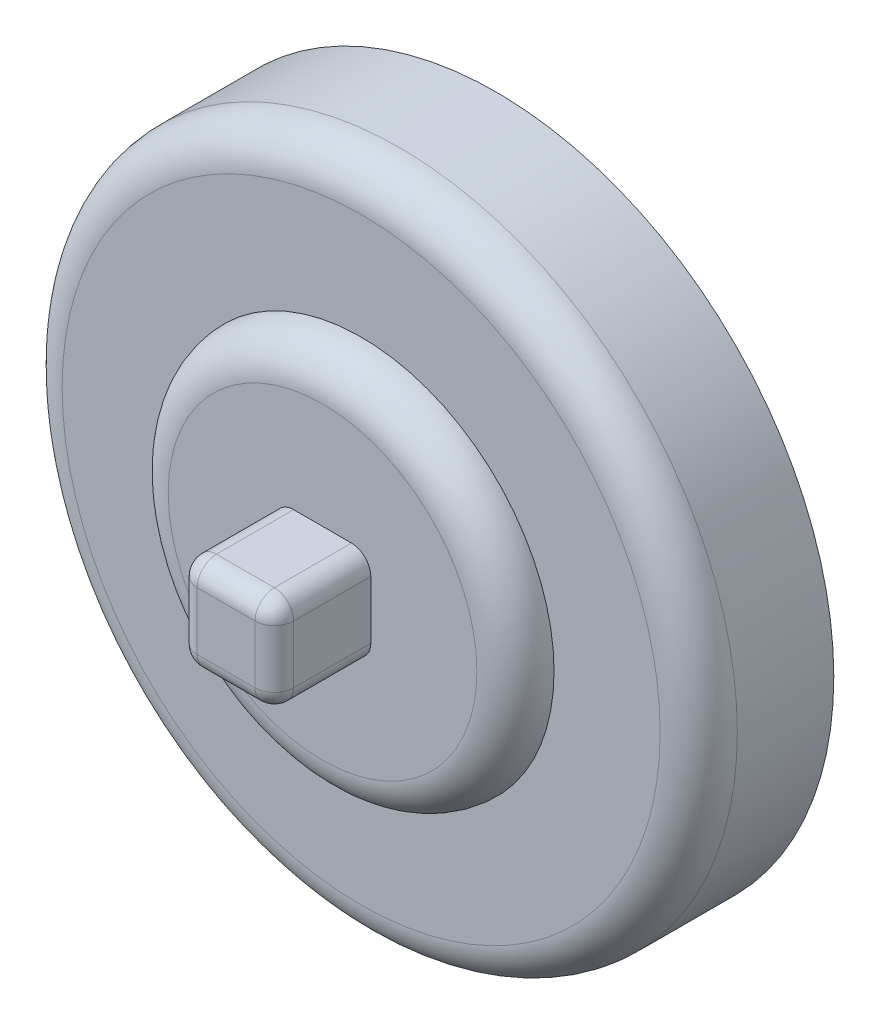
ISO-10303-21;
HEADER;
FILE_DESCRIPTION(('STEP AP214'),'2;1');
FILE_NAME('part.step','',(''),(''),'','','');
FILE_SCHEMA(('AUTOMOTIVE_DESIGN { 1 0 10303 214 1 1 1 1 }'));
ENDSEC;
DATA;
#1=APPLICATION_CONTEXT('core data for automotive mechanical design processes');
#2=APPLICATION_PROTOCOL_DEFINITION('international standard','automotive_design',2000,#1);
#3=PRODUCT_CONTEXT('',#1,'mechanical');
#4=PRODUCT('Part','Part','',(#3));
#5=PRODUCT_RELATED_PRODUCT_CATEGORY('part','',(#4));
#6=PRODUCT_DEFINITION_FORMATION('','',#4);
#7=PRODUCT_DEFINITION_CONTEXT('part definition',#1,'design');
#8=PRODUCT_DEFINITION('design','',#6,#7);
#9=PRODUCT_DEFINITION_SHAPE('','',#8);
#10=(LENGTH_UNIT() NAMED_UNIT(*) SI_UNIT(.MILLI.,.METRE.));
#11=(NAMED_UNIT(*) PLANE_ANGLE_UNIT() SI_UNIT($,.RADIAN.));
#12=(NAMED_UNIT(*) SI_UNIT($,.STERADIAN.) SOLID_ANGLE_UNIT());
#13=UNCERTAINTY_MEASURE_WITH_UNIT(LENGTH_MEASURE(1.E-05),#10,'distance_accuracy_value','');
#14=(GEOMETRIC_REPRESENTATION_CONTEXT(3) GLOBAL_UNCERTAINTY_ASSIGNED_CONTEXT((#13)) GLOBAL_UNIT_ASSIGNED_CONTEXT((#10,
#11,#12)) REPRESENTATION_CONTEXT('',''));
#15=CARTESIAN_POINT('',(0.,0.,0.));
#16=DIRECTION('',(0.,0.,1.));
#17=DIRECTION('',(1.,0.,0.));
#18=AXIS2_PLACEMENT_3D('',#15,#16,#17);
#19=CARTESIAN_POINT('',(0.,0.,8.89));
#20=DIRECTION('',(0.,0.,-1.));
#21=DIRECTION('',(-1.,0.,0.));
#22=AXIS2_PLACEMENT_3D('',#19,#20,#21);
#23=CYLINDRICAL_SURFACE('',#22,22.225);
#24=CARTESIAN_POINT('',(0.,0.,6.35));
#25=DIRECTION('',(0.,0.,1.));
#26=DIRECTION('',(1.,0.,0.));
#27=AXIS2_PLACEMENT_3D('',#24,#25,#26);
#28=CIRCLE('',#27,22.225);
#29=CARTESIAN_POINT('',(22.225,0.,6.35));
#30=VERTEX_POINT('',#29);
#31=EDGE_CURVE('E11',#30,#30,#28,.F.);
#32=ORIENTED_EDGE('',*,*,#31,.T.);
#33=EDGE_LOOP('',(#32));
#34=FACE_BOUND('',#33,.T.);
#35=CARTESIAN_POINT('',(0.,0.,0.));
#36=DIRECTION('',(0.,0.,1.));
#37=DIRECTION('',(1.,0.,0.));
#38=AXIS2_PLACEMENT_3D('',#35,#36,#37);
#39=CIRCLE('',#38,22.225);
#40=CARTESIAN_POINT('',(22.225,0.,0.));
#41=VERTEX_POINT('',#40);
#42=EDGE_CURVE('E24',#41,#41,#39,.T.);
#43=ORIENTED_EDGE('',*,*,#42,.T.);
#44=EDGE_LOOP('',(#43));
#45=FACE_BOUND('',#44,.T.);
#46=ADVANCED_FACE('F17',(#34,#45),#23,.T.);
#47=CARTESIAN_POINT('',(0.,0.,8.89));
#48=DIRECTION('',(0.,0.,1.));
#49=DIRECTION('',(1.,0.,0.));
#50=AXIS2_PLACEMENT_3D('',#47,#48,#49);
#51=PLANE('',#50);
#52=CARTESIAN_POINT('',(0.,0.,8.89));
#53=DIRECTION('',(0.,0.,1.));
#54=DIRECTION('',(1.,0.,0.));
#55=AXIS2_PLACEMENT_3D('',#52,#53,#54);
#56=CIRCLE('',#55,12.7);
#57=CARTESIAN_POINT('',(12.7,0.,8.89));
#58=VERTEX_POINT('',#57);
#59=EDGE_CURVE('E265',#58,#58,#56,.T.);
#60=ORIENTED_EDGE('',*,*,#59,.F.);
#61=EDGE_LOOP('',(#60));
#62=FACE_BOUND('',#61,.T.);
#63=CARTESIAN_POINT('',(0.,0.,8.89));
#64=DIRECTION('',(0.,0.,1.));
#65=DIRECTION('',(1.,0.,0.));
#66=AXIS2_PLACEMENT_3D('',#63,#64,#65);
#67=CIRCLE('',#66,19.685);
#68=CARTESIAN_POINT('',(19.685,0.,8.89));
#69=VERTEX_POINT('',#68);
#70=EDGE_CURVE('E262',#69,#69,#67,.T.);
#71=ORIENTED_EDGE('',*,*,#70,.T.);
#72=EDGE_LOOP('',(#71));
#73=FACE_BOUND('',#72,.T.);
#74=ADVANCED_FACE('F274',(#62,#73),#51,.T.);
#75=CARTESIAN_POINT('',(0.,0.,0.));
#76=DIRECTION('',(0.,0.,1.));
#77=DIRECTION('',(1.,0.,0.));
#78=AXIS2_PLACEMENT_3D('',#75,#76,#77);
#79=PLANE('',#78);
#80=CARTESIAN_POINT('',(0.,0.,0.));
#81=DIRECTION('',(0.,0.,1.));
#82=DIRECTION('',(1.,0.,0.));
#83=AXIS2_PLACEMENT_3D('',#80,#81,#82);
#84=CIRCLE('',#83,20.955);
#85=CARTESIAN_POINT('',(20.955,0.,0.));
#86=VERTEX_POINT('',#85);
#87=EDGE_CURVE('E259',#86,#86,#84,.T.);
#88=ORIENTED_EDGE('',*,*,#87,.T.);
#89=EDGE_LOOP('',(#88));
#90=FACE_BOUND('',#89,.T.);
#91=ORIENTED_EDGE('',*,*,#42,.F.);
#92=EDGE_LOOP('',(#91));
#93=FACE_BOUND('',#92,.T.);
#94=ADVANCED_FACE('F271',(#90,#93),#79,.F.);
#95=CARTESIAN_POINT('',(0.,0.,6.35));
#96=DIRECTION('',(0.,0.,1.));
#97=DIRECTION('',(1.,0.,0.));
#98=AXIS2_PLACEMENT_3D('',#95,#96,#97);
#99=TOROIDAL_SURFACE('',#98,19.685,2.54);
#100=ORIENTED_EDGE('',*,*,#31,.F.);
#101=EDGE_LOOP('',(#100));
#102=FACE_BOUND('',#101,.T.);
#103=ORIENTED_EDGE('',*,*,#70,.F.);
#104=EDGE_LOOP('',(#103));
#105=FACE_BOUND('',#104,.T.);
#106=ADVANCED_FACE('F273',(#102,#105),#99,.T.);
#107=CARTESIAN_POINT('',(0.,0.,11.43));
#108=DIRECTION('',(0.,0.,1.));
#109=DIRECTION('',(1.,0.,0.));
#110=AXIS2_PLACEMENT_3D('',#107,#108,#109);
#111=PLANE('',#110);
#112=DIRECTION('',(1.,0.,0.));
#113=VECTOR('',#112,1.);
#114=CARTESIAN_POINT('',(0.,-3.175,11.43));
#115=LINE('',#114,#113);
#116=CARTESIAN_POINT('',(-1.905,-3.175,11.43));
#117=VERTEX_POINT('',#116);
#118=CARTESIAN_POINT('',(1.905,-3.175,11.43));
#119=VERTEX_POINT('',#118);
#120=EDGE_CURVE('E31',#117,#119,#115,.T.);
#121=ORIENTED_EDGE('',*,*,#120,.F.);
#122=CARTESIAN_POINT('',(-1.905,-1.905,11.43));
#123=DIRECTION('',(0.,0.,1.));
#124=DIRECTION('',(1.,0.,0.));
#125=AXIS2_PLACEMENT_3D('',#122,#123,#124);
#126=CIRCLE('',#125,1.27);
#127=CARTESIAN_POINT('',(-3.175,-1.905,11.43));
#128=VERTEX_POINT('',#127);
#129=EDGE_CURVE('E36',#117,#128,#126,.F.);
#130=ORIENTED_EDGE('',*,*,#129,.T.);
#131=DIRECTION('',(0.,1.,0.));
#132=VECTOR('',#131,1.);
#133=CARTESIAN_POINT('',(-3.175,0.,11.43));
#134=LINE('',#133,#132);
#135=CARTESIAN_POINT('',(-3.175,1.905,11.43));
#136=VERTEX_POINT('',#135);
#137=EDGE_CURVE('E255',#128,#136,#134,.T.);
#138=ORIENTED_EDGE('',*,*,#137,.T.);
#139=CARTESIAN_POINT('',(-1.905,1.905,11.43));
#140=DIRECTION('',(0.,0.,1.));
#141=DIRECTION('',(1.,0.,0.));
#142=AXIS2_PLACEMENT_3D('',#139,#140,#141);
#143=CIRCLE('',#142,1.27);
#144=CARTESIAN_POINT('',(-1.905,3.175,11.43));
#145=VERTEX_POINT('',#144);
#146=EDGE_CURVE('E253',#136,#145,#143,.F.);
#147=ORIENTED_EDGE('',*,*,#146,.T.);
#148=DIRECTION('',(1.,0.,0.));
#149=VECTOR('',#148,1.);
#150=CARTESIAN_POINT('',(0.,3.175,11.43));
#151=LINE('',#150,#149);
#152=CARTESIAN_POINT('',(1.905,3.175,11.43));
#153=VERTEX_POINT('',#152);
#154=EDGE_CURVE('E251',#145,#153,#151,.T.);
#155=ORIENTED_EDGE('',*,*,#154,.T.);
#156=CARTESIAN_POINT('',(1.905,1.905,11.43));
#157=DIRECTION('',(0.,0.,1.));
#158=DIRECTION('',(1.,0.,0.));
#159=AXIS2_PLACEMENT_3D('',#156,#157,#158);
#160=CIRCLE('',#159,1.27);
#161=CARTESIAN_POINT('',(3.175,1.905,11.43));
#162=VERTEX_POINT('',#161);
#163=EDGE_CURVE('E249',#153,#162,#160,.F.);
#164=ORIENTED_EDGE('',*,*,#163,.T.);
#165=DIRECTION('',(0.,1.,0.));
#166=VECTOR('',#165,1.);
#167=CARTESIAN_POINT('',(3.175,0.,11.43));
#168=LINE('',#167,#166);
#169=CARTESIAN_POINT('',(3.175,-1.905,11.43));
#170=VERTEX_POINT('',#169);
#171=EDGE_CURVE('E246',#170,#162,#168,.T.);
#172=ORIENTED_EDGE('',*,*,#171,.F.);
#173=CARTESIAN_POINT('',(1.905,-1.905,11.43));
#174=DIRECTION('',(0.,0.,1.));
#175=DIRECTION('',(1.,0.,0.));
#176=AXIS2_PLACEMENT_3D('',#173,#174,#175);
#177=CIRCLE('',#176,1.27);
#178=EDGE_CURVE('E244',#170,#119,#177,.F.);
#179=ORIENTED_EDGE('',*,*,#178,.T.);
#180=EDGE_LOOP('',(#121,#130,#138,#147,#155,#164,#172,#179));
#181=FACE_BOUND('',#180,.T.);
#182=CARTESIAN_POINT('',(0.,0.,11.43));
#183=DIRECTION('',(0.,0.,1.));
#184=DIRECTION('',(1.,0.,0.));
#185=AXIS2_PLACEMENT_3D('',#182,#183,#184);
#186=CIRCLE('',#185,10.16);
#187=CARTESIAN_POINT('',(10.16,0.,11.43));
#188=VERTEX_POINT('',#187);
#189=EDGE_CURVE('E241',#188,#188,#186,.T.);
#190=ORIENTED_EDGE('',*,*,#189,.T.);
#191=EDGE_LOOP('',(#190));
#192=FACE_BOUND('',#191,.T.);
#193=ADVANCED_FACE('F282',(#181,#192),#111,.T.);
#194=CARTESIAN_POINT('',(0.,0.,8.89));
#195=DIRECTION('',(0.,0.,1.));
#196=DIRECTION('',(1.,0.,0.));
#197=AXIS2_PLACEMENT_3D('',#194,#195,#196);
#198=TOROIDAL_SURFACE('',#197,10.16,2.54);
#199=ORIENTED_EDGE('',*,*,#59,.T.);
#200=EDGE_LOOP('',(#199));
#201=FACE_BOUND('',#200,.T.);
#202=ORIENTED_EDGE('',*,*,#189,.F.);
#203=EDGE_LOOP('',(#202));
#204=FACE_BOUND('',#203,.T.);
#205=ADVANCED_FACE('F333',(#201,#204),#198,.T.);
#206=CARTESIAN_POINT('',(-3.175,0.,17.78));
#207=DIRECTION('',(-1.,0.,0.));
#208=DIRECTION('',(0.,-1.,0.));
#209=AXIS2_PLACEMENT_3D('',#206,#207,#208);
#210=PLANE('',#209);
#211=ORIENTED_EDGE('',*,*,#137,.F.);
#212=DIRECTION('',(0.,0.,-1.));
#213=VECTOR('',#212,1.);
#214=CARTESIAN_POINT('',(-3.175,-1.905,17.78));
#215=LINE('',#214,#213);
#216=CARTESIAN_POINT('',(-3.175,-1.905,16.51));
#217=VERTEX_POINT('',#216);
#218=EDGE_CURVE('E239',#128,#217,#215,.F.);
#219=ORIENTED_EDGE('',*,*,#218,.T.);
#220=DIRECTION('',(0.,1.,0.));
#221=VECTOR('',#220,1.);
#222=CARTESIAN_POINT('',(-3.175,0.,16.51));
#223=LINE('',#222,#221);
#224=CARTESIAN_POINT('',(-3.175,1.905,16.51));
#225=VERTEX_POINT('',#224);
#226=EDGE_CURVE('E237',#217,#225,#223,.T.);
#227=ORIENTED_EDGE('',*,*,#226,.T.);
#228=DIRECTION('',(0.,0.,-1.));
#229=VECTOR('',#228,1.);
#230=CARTESIAN_POINT('',(-3.175,1.905,17.78));
#231=LINE('',#230,#229);
#232=EDGE_CURVE('E234',#225,#136,#231,.T.);
#233=ORIENTED_EDGE('',*,*,#232,.T.);
#234=EDGE_LOOP('',(#211,#219,#227,#233));
#235=FACE_BOUND('',#234,.T.);
#236=ADVANCED_FACE('F342',(#235),#210,.T.);
#237=CARTESIAN_POINT('',(0.,-3.175,17.78));
#238=DIRECTION('',(0.,1.,0.));
#239=DIRECTION('',(0.,0.,1.));
#240=AXIS2_PLACEMENT_3D('',#237,#238,#239);
#241=PLANE('',#240);
#242=ORIENTED_EDGE('',*,*,#120,.T.);
#243=DIRECTION('',(0.,0.,-1.));
#244=VECTOR('',#243,1.);
#245=CARTESIAN_POINT('',(1.905,-3.175,17.78));
#246=LINE('',#245,#244);
#247=CARTESIAN_POINT('',(1.905,-3.175,16.51));
#248=VERTEX_POINT('',#247);
#249=EDGE_CURVE('E232',#119,#248,#246,.F.);
#250=ORIENTED_EDGE('',*,*,#249,.T.);
#251=DIRECTION('',(1.,0.,0.));
#252=VECTOR('',#251,1.);
#253=CARTESIAN_POINT('',(-3.175,-3.175,16.51));
#254=LINE('',#253,#252);
#255=CARTESIAN_POINT('',(-1.905,-3.175,16.51));
#256=VERTEX_POINT('',#255);
#257=EDGE_CURVE('E230',#248,#256,#254,.F.);
#258=ORIENTED_EDGE('',*,*,#257,.T.);
#259=DIRECTION('',(0.,0.,-1.));
#260=VECTOR('',#259,1.);
#261=CARTESIAN_POINT('',(-1.905,-3.175,11.43));
#262=LINE('',#261,#260);
#263=EDGE_CURVE('E228',#256,#117,#262,.T.);
#264=ORIENTED_EDGE('',*,*,#263,.T.);
#265=EDGE_LOOP('',(#242,#250,#258,#264));
#266=FACE_BOUND('',#265,.T.);
#267=ADVANCED_FACE('F352',(#266),#241,.F.);
#268=CARTESIAN_POINT('',(3.175,0.,17.78));
#269=DIRECTION('',(-1.,0.,0.));
#270=DIRECTION('',(0.,-1.,0.));
#271=AXIS2_PLACEMENT_3D('',#268,#269,#270);
#272=PLANE('',#271);
#273=ORIENTED_EDGE('',*,*,#171,.T.);
#274=DIRECTION('',(0.,0.,-1.));
#275=VECTOR('',#274,1.);
#276=CARTESIAN_POINT('',(3.175,1.905,17.78));
#277=LINE('',#276,#275);
#278=CARTESIAN_POINT('',(3.175,1.905,16.51));
#279=VERTEX_POINT('',#278);
#280=EDGE_CURVE('E226',#162,#279,#277,.F.);
#281=ORIENTED_EDGE('',*,*,#280,.T.);
#282=DIRECTION('',(0.,1.,0.));
#283=VECTOR('',#282,1.);
#284=CARTESIAN_POINT('',(3.175,-3.175,16.51));
#285=LINE('',#284,#283);
#286=CARTESIAN_POINT('',(3.175,-1.905,16.51));
#287=VERTEX_POINT('',#286);
#288=EDGE_CURVE('E224',#279,#287,#285,.F.);
#289=ORIENTED_EDGE('',*,*,#288,.T.);
#290=DIRECTION('',(0.,0.,-1.));
#291=VECTOR('',#290,1.);
#292=CARTESIAN_POINT('',(3.175,-1.905,17.78));
#293=LINE('',#292,#291);
#294=EDGE_CURVE('E221',#287,#170,#293,.T.);
#295=ORIENTED_EDGE('',*,*,#294,.T.);
#296=EDGE_LOOP('',(#273,#281,#289,#295));
#297=FACE_BOUND('',#296,.T.);
#298=ADVANCED_FACE('F362',(#297),#272,.F.);
#299=CARTESIAN_POINT('',(0.,3.175,17.78));
#300=DIRECTION('',(0.,1.,0.));
#301=DIRECTION('',(0.,0.,1.));
#302=AXIS2_PLACEMENT_3D('',#299,#300,#301);
#303=PLANE('',#302);
#304=DIRECTION('',(1.,0.,0.));
#305=VECTOR('',#304,1.);
#306=CARTESIAN_POINT('',(0.,3.175,16.51));
#307=LINE('',#306,#305);
#308=CARTESIAN_POINT('',(-1.905,3.175,16.51));
#309=VERTEX_POINT('',#308);
#310=CARTESIAN_POINT('',(1.905,3.175,16.51));
#311=VERTEX_POINT('',#310);
#312=EDGE_CURVE('E219',#309,#311,#307,.T.);
#313=ORIENTED_EDGE('',*,*,#312,.T.);
#314=DIRECTION('',(0.,0.,-1.));
#315=VECTOR('',#314,1.);
#316=CARTESIAN_POINT('',(1.905,3.175,11.43));
#317=LINE('',#316,#315);
#318=EDGE_CURVE('E216',#311,#153,#317,.T.);
#319=ORIENTED_EDGE('',*,*,#318,.T.);
#320=ORIENTED_EDGE('',*,*,#154,.F.);
#321=DIRECTION('',(0.,0.,-1.));
#322=VECTOR('',#321,1.);
#323=CARTESIAN_POINT('',(-1.905,3.175,17.78));
#324=LINE('',#323,#322);
#325=EDGE_CURVE('E214',#145,#309,#324,.F.);
#326=ORIENTED_EDGE('',*,*,#325,.T.);
#327=EDGE_LOOP('',(#313,#319,#320,#326));
#328=FACE_BOUND('',#327,.T.);
#329=ADVANCED_FACE('F372',(#328),#303,.T.);
#330=CARTESIAN_POINT('',(0.,0.,17.78));
#331=DIRECTION('',(0.,0.,1.));
#332=DIRECTION('',(1.,0.,0.));
#333=AXIS2_PLACEMENT_3D('',#330,#331,#332);
#334=PLANE('',#333);
#335=DIRECTION('',(1.,0.,0.));
#336=VECTOR('',#335,1.);
#337=CARTESIAN_POINT('',(3.175,-1.905,17.78));
#338=LINE('',#337,#336);
#339=CARTESIAN_POINT('',(-1.905,-1.905,17.78));
#340=VERTEX_POINT('',#339);
#341=CARTESIAN_POINT('',(1.905,-1.905,17.78));
#342=VERTEX_POINT('',#341);
#343=EDGE_CURVE('E212',#340,#342,#338,.T.);
#344=ORIENTED_EDGE('',*,*,#343,.T.);
#345=DIRECTION('',(0.,1.,0.));
#346=VECTOR('',#345,1.);
#347=CARTESIAN_POINT('',(1.905,3.175,17.78));
#348=LINE('',#347,#346);
#349=CARTESIAN_POINT('',(1.905,1.905,17.78));
#350=VERTEX_POINT('',#349);
#351=EDGE_CURVE('E210',#342,#350,#348,.T.);
#352=ORIENTED_EDGE('',*,*,#351,.T.);
#353=DIRECTION('',(1.,0.,0.));
#354=VECTOR('',#353,1.);
#355=CARTESIAN_POINT('',(0.,1.905,17.78));
#356=LINE('',#355,#354);
#357=CARTESIAN_POINT('',(-1.905,1.905,17.78));
#358=VERTEX_POINT('',#357);
#359=EDGE_CURVE('E208',#350,#358,#356,.F.);
#360=ORIENTED_EDGE('',*,*,#359,.T.);
#361=DIRECTION('',(0.,1.,0.));
#362=VECTOR('',#361,1.);
#363=CARTESIAN_POINT('',(-1.905,0.,17.78));
#364=LINE('',#363,#362);
#365=EDGE_CURVE('E206',#358,#340,#364,.F.);
#366=ORIENTED_EDGE('',*,*,#365,.T.);
#367=EDGE_LOOP('',(#344,#352,#360,#366));
#368=FACE_BOUND('',#367,.T.);
#369=ADVANCED_FACE('F382',(#368),#334,.T.);
#370=CARTESIAN_POINT('',(-1.905,-1.905,17.78));
#371=DIRECTION('',(0.,0.,1.));
#372=DIRECTION('',(1.,0.,0.));
#373=AXIS2_PLACEMENT_3D('',#370,#371,#372);
#374=CYLINDRICAL_SURFACE('',#373,1.27);
#375=CARTESIAN_POINT('',(-1.905,-1.905,16.51));
#376=DIRECTION('',(0.,0.,1.));
#377=DIRECTION('',(1.,0.,0.));
#378=AXIS2_PLACEMENT_3D('',#375,#376,#377);
#379=CIRCLE('',#378,1.27);
#380=EDGE_CURVE('E203',#217,#256,#379,.T.);
#381=ORIENTED_EDGE('',*,*,#380,.F.);
#382=ORIENTED_EDGE('',*,*,#218,.F.);
#383=ORIENTED_EDGE('',*,*,#129,.F.);
#384=ORIENTED_EDGE('',*,*,#263,.F.);
#385=EDGE_LOOP('',(#381,#382,#383,#384));
#386=FACE_BOUND('',#385,.T.);
#387=ADVANCED_FACE('F392',(#386),#374,.T.);
#388=CARTESIAN_POINT('',(-1.905,-1.905,16.51));
#389=DIRECTION('',(0.,-1.,0.));
#390=DIRECTION('',(0.,0.,-1.));
#391=AXIS2_PLACEMENT_3D('',#388,#389,#390);
#392=SPHERICAL_SURFACE('',#391,1.27);
#393=CARTESIAN_POINT('',(-1.905,-1.905,16.51));
#394=DIRECTION('',(0.,-1.,0.));
#395=DIRECTION('',(1.,0.,0.));
#396=AXIS2_PLACEMENT_3D('',#393,#394,#395);
#397=CIRCLE('',#396,1.27);
#398=EDGE_CURVE('E200',#217,#340,#397,.F.);
#399=ORIENTED_EDGE('',*,*,#398,.F.);
#400=ORIENTED_EDGE('',*,*,#380,.T.);
#401=CARTESIAN_POINT('',(-1.905,-1.905,16.51));
#402=DIRECTION('',(-1.,0.,0.));
#403=DIRECTION('',(0.,0.,1.));
#404=AXIS2_PLACEMENT_3D('',#401,#402,#403);
#405=CIRCLE('',#404,1.27);
#406=EDGE_CURVE('E197',#340,#256,#405,.F.);
#407=ORIENTED_EDGE('',*,*,#406,.F.);
#408=EDGE_LOOP('',(#399,#400,#407));
#409=FACE_BOUND('',#408,.T.);
#410=ADVANCED_FACE('F402',(#409),#392,.T.);
#411=CARTESIAN_POINT('',(1.905,-1.905,17.78));
#412=DIRECTION('',(0.,0.,-1.));
#413=DIRECTION('',(-1.,0.,0.));
#414=AXIS2_PLACEMENT_3D('',#411,#412,#413);
#415=CYLINDRICAL_SURFACE('',#414,1.27);
#416=ORIENTED_EDGE('',*,*,#178,.F.);
#417=ORIENTED_EDGE('',*,*,#294,.F.);
#418=CARTESIAN_POINT('',(1.905,-1.905,16.51));
#419=DIRECTION('',(0.,0.,1.));
#420=DIRECTION('',(1.,0.,0.));
#421=AXIS2_PLACEMENT_3D('',#418,#419,#420);
#422=CIRCLE('',#421,1.27);
#423=EDGE_CURVE('E194',#248,#287,#422,.T.);
#424=ORIENTED_EDGE('',*,*,#423,.F.);
#425=ORIENTED_EDGE('',*,*,#249,.F.);
#426=EDGE_LOOP('',(#416,#417,#424,#425));
#427=FACE_BOUND('',#426,.T.);
#428=ADVANCED_FACE('F412',(#427),#415,.T.);
#429=CARTESIAN_POINT('',(0.,-1.905,16.51));
#430=DIRECTION('',(-1.,0.,0.));
#431=DIRECTION('',(0.,0.,1.));
#432=AXIS2_PLACEMENT_3D('',#429,#430,#431);
#433=CYLINDRICAL_SURFACE('',#432,1.27);
#434=ORIENTED_EDGE('',*,*,#406,.T.);
#435=ORIENTED_EDGE('',*,*,#257,.F.);
#436=CARTESIAN_POINT('',(1.905,-1.905,16.51));
#437=DIRECTION('',(1.,0.,0.));
#438=DIRECTION('',(0.,0.,-1.));
#439=AXIS2_PLACEMENT_3D('',#436,#437,#438);
#440=CIRCLE('',#439,1.27);
#441=EDGE_CURVE('E191',#342,#248,#440,.T.);
#442=ORIENTED_EDGE('',*,*,#441,.F.);
#443=ORIENTED_EDGE('',*,*,#343,.F.);
#444=EDGE_LOOP('',(#434,#435,#442,#443));
#445=FACE_BOUND('',#444,.T.);
#446=ADVANCED_FACE('F422',(#445),#433,.T.);
#447=CARTESIAN_POINT('',(-1.905,0.,16.51));
#448=DIRECTION('',(0.,1.,0.));
#449=DIRECTION('',(-1.,0.,0.));
#450=AXIS2_PLACEMENT_3D('',#447,#448,#449);
#451=CYLINDRICAL_SURFACE('',#450,1.27);
#452=ORIENTED_EDGE('',*,*,#398,.T.);
#453=ORIENTED_EDGE('',*,*,#365,.F.);
#454=CARTESIAN_POINT('',(-1.905,1.905,16.51));
#455=DIRECTION('',(0.,1.,0.));
#456=DIRECTION('',(-1.,0.,0.));
#457=AXIS2_PLACEMENT_3D('',#454,#455,#456);
#458=CIRCLE('',#457,1.27);
#459=EDGE_CURVE('E188',#225,#358,#458,.T.);
#460=ORIENTED_EDGE('',*,*,#459,.F.);
#461=ORIENTED_EDGE('',*,*,#226,.F.);
#462=EDGE_LOOP('',(#452,#453,#460,#461));
#463=FACE_BOUND('',#462,.T.);
#464=ADVANCED_FACE('F432',(#463),#451,.T.);
#465=CARTESIAN_POINT('',(-1.905,1.905,17.78));
#466=DIRECTION('',(0.,0.,-1.));
#467=DIRECTION('',(-1.,0.,0.));
#468=AXIS2_PLACEMENT_3D('',#465,#466,#467);
#469=CYLINDRICAL_SURFACE('',#468,1.27);
#470=ORIENTED_EDGE('',*,*,#146,.F.);
#471=ORIENTED_EDGE('',*,*,#232,.F.);
#472=CARTESIAN_POINT('',(-1.905,1.905,16.51));
#473=DIRECTION('',(0.,0.,1.));
#474=DIRECTION('',(1.,0.,0.));
#475=AXIS2_PLACEMENT_3D('',#472,#473,#474);
#476=CIRCLE('',#475,1.27);
#477=EDGE_CURVE('E185',#309,#225,#476,.T.);
#478=ORIENTED_EDGE('',*,*,#477,.F.);
#479=ORIENTED_EDGE('',*,*,#325,.F.);
#480=EDGE_LOOP('',(#470,#471,#478,#479));
#481=FACE_BOUND('',#480,.T.);
#482=ADVANCED_FACE('F442',(#481),#469,.T.);
#483=CARTESIAN_POINT('',(1.905,-1.905,16.51));
#484=DIRECTION('',(0.,-1.,0.));
#485=DIRECTION('',(0.,0.,-1.));
#486=AXIS2_PLACEMENT_3D('',#483,#484,#485);
#487=SPHERICAL_SURFACE('',#486,1.27);
#488=ORIENTED_EDGE('',*,*,#441,.T.);
#489=ORIENTED_EDGE('',*,*,#423,.T.);
#490=CARTESIAN_POINT('',(1.905,-1.905,16.51));
#491=DIRECTION('',(0.,-1.,0.));
#492=DIRECTION('',(1.,0.,0.));
#493=AXIS2_PLACEMENT_3D('',#490,#491,#492);
#494=CIRCLE('',#493,1.27);
#495=EDGE_CURVE('E182',#342,#287,#494,.F.);
#496=ORIENTED_EDGE('',*,*,#495,.F.);
#497=EDGE_LOOP('',(#488,#489,#496));
#498=FACE_BOUND('',#497,.T.);
#499=ADVANCED_FACE('F452',(#498),#487,.T.);
#500=CARTESIAN_POINT('',(-1.905,1.905,16.51));
#501=DIRECTION('',(-1.,0.,0.));
#502=DIRECTION('',(0.,-1.,0.));
#503=AXIS2_PLACEMENT_3D('',#500,#501,#502);
#504=SPHERICAL_SURFACE('',#503,1.27);
#505=ORIENTED_EDGE('',*,*,#477,.T.);
#506=ORIENTED_EDGE('',*,*,#459,.T.);
#507=CARTESIAN_POINT('',(-1.905,1.905,16.51));
#508=DIRECTION('',(-1.,0.,0.));
#509=DIRECTION('',(0.,0.,1.));
#510=AXIS2_PLACEMENT_3D('',#507,#508,#509);
#511=CIRCLE('',#510,1.27);
#512=EDGE_CURVE('E179',#309,#358,#511,.F.);
#513=ORIENTED_EDGE('',*,*,#512,.F.);
#514=EDGE_LOOP('',(#505,#506,#513));
#515=FACE_BOUND('',#514,.T.);
#516=ADVANCED_FACE('F462',(#515),#504,.T.);
#517=CARTESIAN_POINT('',(1.905,0.,16.51));
#518=DIRECTION('',(0.,-1.,0.));
#519=DIRECTION('',(1.,0.,0.));
#520=AXIS2_PLACEMENT_3D('',#517,#518,#519);
#521=CYLINDRICAL_SURFACE('',#520,1.27);
#522=ORIENTED_EDGE('',*,*,#495,.T.);
#523=ORIENTED_EDGE('',*,*,#288,.F.);
#524=CARTESIAN_POINT('',(1.905,1.905,16.51));
#525=DIRECTION('',(0.,1.,0.));
#526=DIRECTION('',(-1.,0.,0.));
#527=AXIS2_PLACEMENT_3D('',#524,#525,#526);
#528=CIRCLE('',#527,1.27);
#529=EDGE_CURVE('E176',#350,#279,#528,.T.);
#530=ORIENTED_EDGE('',*,*,#529,.F.);
#531=ORIENTED_EDGE('',*,*,#351,.F.);
#532=EDGE_LOOP('',(#522,#523,#530,#531));
#533=FACE_BOUND('',#532,.T.);
#534=ADVANCED_FACE('F472',(#533),#521,.T.);
#535=CARTESIAN_POINT('',(0.,1.905,16.51));
#536=DIRECTION('',(1.,0.,0.));
#537=DIRECTION('',(0.,0.,-1.));
#538=AXIS2_PLACEMENT_3D('',#535,#536,#537);
#539=CYLINDRICAL_SURFACE('',#538,1.27);
#540=ORIENTED_EDGE('',*,*,#512,.T.);
#541=ORIENTED_EDGE('',*,*,#359,.F.);
#542=CARTESIAN_POINT('',(1.905,1.905,16.51));
#543=DIRECTION('',(1.,0.,0.));
#544=DIRECTION('',(0.,0.,-1.));
#545=AXIS2_PLACEMENT_3D('',#542,#543,#544);
#546=CIRCLE('',#545,1.27);
#547=EDGE_CURVE('E173',#311,#350,#546,.T.);
#548=ORIENTED_EDGE('',*,*,#547,.F.);
#549=ORIENTED_EDGE('',*,*,#312,.F.);
#550=EDGE_LOOP('',(#540,#541,#548,#549));
#551=FACE_BOUND('',#550,.T.);
#552=ADVANCED_FACE('F482',(#551),#539,.T.);
#553=CARTESIAN_POINT('',(1.905,1.905,16.51));
#554=DIRECTION('',(0.,0.,1.));
#555=DIRECTION('',(1.,0.,0.));
#556=AXIS2_PLACEMENT_3D('',#553,#554,#555);
#557=SPHERICAL_SURFACE('',#556,1.27);
#558=ORIENTED_EDGE('',*,*,#547,.T.);
#559=ORIENTED_EDGE('',*,*,#529,.T.);
#560=CARTESIAN_POINT('',(1.905,1.905,16.51));
#561=DIRECTION('',(0.,0.,1.));
#562=DIRECTION('',(1.,0.,0.));
#563=AXIS2_PLACEMENT_3D('',#560,#561,#562);
#564=CIRCLE('',#563,1.27);
#565=EDGE_CURVE('E170',#311,#279,#564,.F.);
#566=ORIENTED_EDGE('',*,*,#565,.F.);
#567=EDGE_LOOP('',(#558,#559,#566));
#568=FACE_BOUND('',#567,.T.);
#569=ADVANCED_FACE('F492',(#568),#557,.T.);
#570=CARTESIAN_POINT('',(1.905,1.905,17.78));
#571=DIRECTION('',(0.,0.,1.));
#572=DIRECTION('',(1.,0.,0.));
#573=AXIS2_PLACEMENT_3D('',#570,#571,#572);
#574=CYLINDRICAL_SURFACE('',#573,1.27);
#575=ORIENTED_EDGE('',*,*,#565,.T.);
#576=ORIENTED_EDGE('',*,*,#280,.F.);
#577=ORIENTED_EDGE('',*,*,#163,.F.);
#578=ORIENTED_EDGE('',*,*,#318,.F.);
#579=EDGE_LOOP('',(#575,#576,#577,#578));
#580=FACE_BOUND('',#579,.T.);
#581=ADVANCED_FACE('F502',(#580),#574,.T.);
#582=CARTESIAN_POINT('',(0.,0.,8.89));
#583=DIRECTION('',(0.,0.,-1.));
#584=DIRECTION('',(-1.,0.,0.));
#585=AXIS2_PLACEMENT_3D('',#582,#583,#584);
#586=CYLINDRICAL_SURFACE('',#585,20.955);
#587=CARTESIAN_POINT('',(0.,0.,6.35));
#588=DIRECTION('',(0.,0.,-1.));
#589=DIRECTION('',(-1.,0.,0.));
#590=AXIS2_PLACEMENT_3D('',#587,#588,#589);
#591=CIRCLE('',#590,20.955);
#592=CARTESIAN_POINT('',(-20.955,0.,6.35));
#593=VERTEX_POINT('',#592);
#594=EDGE_CURVE('E167',#593,#593,#591,.T.);
#595=ORIENTED_EDGE('',*,*,#594,.F.);
#596=EDGE_LOOP('',(#595));
#597=FACE_BOUND('',#596,.T.);
#598=ORIENTED_EDGE('',*,*,#87,.F.);
#599=EDGE_LOOP('',(#598));
#600=FACE_BOUND('',#599,.T.);
#601=ADVANCED_FACE('F512',(#597,#600),#586,.F.);
#602=CARTESIAN_POINT('',(0.,0.,7.62));
#603=DIRECTION('',(0.,0.,1.));
#604=DIRECTION('',(1.,0.,0.));
#605=AXIS2_PLACEMENT_3D('',#602,#603,#604);
#606=PLANE('',#605);
#607=CARTESIAN_POINT('',(0.,0.,7.62));
#608=DIRECTION('',(0.,0.,1.));
#609=DIRECTION('',(1.,0.,0.));
#610=AXIS2_PLACEMENT_3D('',#607,#608,#609);
#611=CIRCLE('',#610,10.16);
#612=CARTESIAN_POINT('',(10.16,0.,7.62));
#613=VERTEX_POINT('',#612);
#614=EDGE_CURVE('E164',#613,#613,#611,.T.);
#615=ORIENTED_EDGE('',*,*,#614,.T.);
#616=EDGE_LOOP('',(#615));
#617=FACE_BOUND('',#616,.T.);
#618=CARTESIAN_POINT('',(0.,0.,7.62));
#619=DIRECTION('',(0.,0.,1.));
#620=DIRECTION('',(1.,0.,0.));
#621=AXIS2_PLACEMENT_3D('',#618,#619,#620);
#622=CIRCLE('',#621,19.685);
#623=CARTESIAN_POINT('',(19.685,0.,7.62));
#624=VERTEX_POINT('',#623);
#625=EDGE_CURVE('E161',#624,#624,#622,.T.);
#626=ORIENTED_EDGE('',*,*,#625,.F.);
#627=EDGE_LOOP('',(#626));
#628=FACE_BOUND('',#627,.T.);
#629=ADVANCED_FACE('F522',(#617,#628),#606,.F.);
#630=CARTESIAN_POINT('',(0.,0.,6.35));
#631=DIRECTION('',(0.,0.,1.));
#632=DIRECTION('',(1.,0.,0.));
#633=AXIS2_PLACEMENT_3D('',#630,#631,#632);
#634=TOROIDAL_SURFACE('',#633,19.685,1.27);
#635=ORIENTED_EDGE('',*,*,#594,.T.);
#636=EDGE_LOOP('',(#635));
#637=FACE_BOUND('',#636,.T.);
#638=ORIENTED_EDGE('',*,*,#625,.T.);
#639=EDGE_LOOP('',(#638));
#640=FACE_BOUND('',#639,.T.);
#641=ADVANCED_FACE('F532',(#637,#640),#634,.F.);
#642=CARTESIAN_POINT('',(0.,0.,10.16));
#643=DIRECTION('',(0.,0.,1.));
#644=DIRECTION('',(1.,0.,0.));
#645=AXIS2_PLACEMENT_3D('',#642,#643,#644);
#646=PLANE('',#645);
#647=DIRECTION('',(1.,0.,0.));
#648=VECTOR('',#647,1.);
#649=CARTESIAN_POINT('',(0.,-1.905,10.16));
#650=LINE('',#649,#648);
#651=CARTESIAN_POINT('',(-1.905,-1.905,10.16));
#652=VERTEX_POINT('',#651);
#653=CARTESIAN_POINT('',(1.905,-1.905,10.16));
#654=VERTEX_POINT('',#653);
#655=EDGE_CURVE('E159',#652,#654,#650,.T.);
#656=ORIENTED_EDGE('',*,*,#655,.T.);
#657=DIRECTION('',(0.,1.,0.));
#658=VECTOR('',#657,1.);
#659=CARTESIAN_POINT('',(1.905,0.,10.16));
#660=LINE('',#659,#658);
#661=CARTESIAN_POINT('',(1.905,1.905,10.16));
#662=VERTEX_POINT('',#661);
#663=EDGE_CURVE('E157',#654,#662,#660,.T.);
#664=ORIENTED_EDGE('',*,*,#663,.T.);
#665=DIRECTION('',(1.,0.,0.));
#666=VECTOR('',#665,1.);
#667=CARTESIAN_POINT('',(0.,1.905,10.16));
#668=LINE('',#667,#666);
#669=CARTESIAN_POINT('',(-1.905,1.905,10.16));
#670=VERTEX_POINT('',#669);
#671=EDGE_CURVE('E135',#670,#662,#668,.T.);
#672=ORIENTED_EDGE('',*,*,#671,.F.);
#673=DIRECTION('',(0.,1.,0.));
#674=VECTOR('',#673,1.);
#675=CARTESIAN_POINT('',(-1.905,0.,10.16));
#676=LINE('',#675,#674);
#677=EDGE_CURVE('E153',#652,#670,#676,.T.);
#678=ORIENTED_EDGE('',*,*,#677,.F.);
#679=EDGE_LOOP('',(#656,#664,#672,#678));
#680=FACE_BOUND('',#679,.T.);
#681=CARTESIAN_POINT('',(0.,0.,10.16));
#682=DIRECTION('',(0.,0.,1.));
#683=DIRECTION('',(1.,0.,0.));
#684=AXIS2_PLACEMENT_3D('',#681,#682,#683);
#685=CIRCLE('',#684,10.16);
#686=CARTESIAN_POINT('',(10.16,0.,10.16));
#687=VERTEX_POINT('',#686);
#688=EDGE_CURVE('E150',#687,#687,#685,.T.);
#689=ORIENTED_EDGE('',*,*,#688,.F.);
#690=EDGE_LOOP('',(#689));
#691=FACE_BOUND('',#690,.T.);
#692=ADVANCED_FACE('F542',(#680,#691),#646,.F.);
#693=CARTESIAN_POINT('',(0.,0.,8.89));
#694=DIRECTION('',(0.,0.,1.));
#695=DIRECTION('',(1.,0.,0.));
#696=AXIS2_PLACEMENT_3D('',#693,#694,#695);
#697=TOROIDAL_SURFACE('',#696,10.16,1.27);
#698=ORIENTED_EDGE('',*,*,#614,.F.);
#699=EDGE_LOOP('',(#698));
#700=FACE_BOUND('',#699,.T.);
#701=ORIENTED_EDGE('',*,*,#688,.T.);
#702=EDGE_LOOP('',(#701));
#703=FACE_BOUND('',#702,.T.);
#704=ADVANCED_FACE('F552',(#700,#703),#697,.F.);
#705=CARTESIAN_POINT('',(-1.905,0.,17.78));
#706=DIRECTION('',(-1.,0.,0.));
#707=DIRECTION('',(0.,-1.,0.));
#708=AXIS2_PLACEMENT_3D('',#705,#706,#707);
#709=PLANE('',#708);
#710=ORIENTED_EDGE('',*,*,#677,.T.);
#711=DIRECTION('',(0.,0.,-1.));
#712=VECTOR('',#711,1.);
#713=CARTESIAN_POINT('',(-1.905,1.905,17.78));
#714=LINE('',#713,#712);
#715=CARTESIAN_POINT('',(-1.905,1.905,16.51));
#716=VERTEX_POINT('',#715);
#717=EDGE_CURVE('E148',#716,#670,#714,.T.);
#718=ORIENTED_EDGE('',*,*,#717,.F.);
#719=DIRECTION('',(0.,-1.,0.));
#720=VECTOR('',#719,1.);
#721=CARTESIAN_POINT('',(-1.905,0.,16.51));
#722=LINE('',#721,#720);
#723=CARTESIAN_POINT('',(-1.905,-1.905,16.51));
#724=VERTEX_POINT('',#723);
#725=EDGE_CURVE('E138',#716,#724,#722,.T.);
#726=ORIENTED_EDGE('',*,*,#725,.T.);
#727=DIRECTION('',(0.,0.,1.));
#728=VECTOR('',#727,1.);
#729=CARTESIAN_POINT('',(-1.905,-1.905,17.78));
#730=LINE('',#729,#728);
#731=EDGE_CURVE('E144',#652,#724,#730,.T.);
#732=ORIENTED_EDGE('',*,*,#731,.F.);
#733=EDGE_LOOP('',(#710,#718,#726,#732));
#734=FACE_BOUND('',#733,.T.);
#735=ADVANCED_FACE('F562',(#734),#709,.F.);
#736=CARTESIAN_POINT('',(0.,-1.905,17.78));
#737=DIRECTION('',(0.,1.,0.));
#738=DIRECTION('',(0.,0.,1.));
#739=AXIS2_PLACEMENT_3D('',#736,#737,#738);
#740=PLANE('',#739);
#741=ORIENTED_EDGE('',*,*,#655,.F.);
#742=ORIENTED_EDGE('',*,*,#731,.T.);
#743=DIRECTION('',(-1.,0.,0.));
#744=VECTOR('',#743,1.);
#745=CARTESIAN_POINT('',(0.,-1.905,16.51));
#746=LINE('',#745,#744);
#747=CARTESIAN_POINT('',(1.905,-1.905,16.51));
#748=VERTEX_POINT('',#747);
#749=EDGE_CURVE('E142',#748,#724,#746,.T.);
#750=ORIENTED_EDGE('',*,*,#749,.F.);
#751=DIRECTION('',(0.,0.,-1.));
#752=VECTOR('',#751,1.);
#753=CARTESIAN_POINT('',(1.905,-1.905,17.78));
#754=LINE('',#753,#752);
#755=EDGE_CURVE('E124',#748,#654,#754,.T.);
#756=ORIENTED_EDGE('',*,*,#755,.T.);
#757=EDGE_LOOP('',(#741,#742,#750,#756));
#758=FACE_BOUND('',#757,.T.);
#759=ADVANCED_FACE('F572',(#758),#740,.T.);
#760=CARTESIAN_POINT('',(1.905,0.,17.78));
#761=DIRECTION('',(-1.,0.,0.));
#762=DIRECTION('',(0.,-1.,0.));
#763=AXIS2_PLACEMENT_3D('',#760,#761,#762);
#764=PLANE('',#763);
#765=ORIENTED_EDGE('',*,*,#663,.F.);
#766=ORIENTED_EDGE('',*,*,#755,.F.);
#767=DIRECTION('',(0.,-1.,0.));
#768=VECTOR('',#767,1.);
#769=CARTESIAN_POINT('',(1.905,0.,16.51));
#770=LINE('',#769,#768);
#771=CARTESIAN_POINT('',(1.905,1.905,16.51));
#772=VERTEX_POINT('',#771);
#773=EDGE_CURVE('E117',#772,#748,#770,.T.);
#774=ORIENTED_EDGE('',*,*,#773,.F.);
#775=DIRECTION('',(0.,0.,1.));
#776=VECTOR('',#775,1.);
#777=CARTESIAN_POINT('',(1.905,1.905,17.78));
#778=LINE('',#777,#776);
#779=EDGE_CURVE('E121',#662,#772,#778,.T.);
#780=ORIENTED_EDGE('',*,*,#779,.F.);
#781=EDGE_LOOP('',(#765,#766,#774,#780));
#782=FACE_BOUND('',#781,.T.);
#783=ADVANCED_FACE('F120',(#782),#764,.T.);
#784=CARTESIAN_POINT('',(0.,1.905,17.78));
#785=DIRECTION('',(0.,1.,0.));
#786=DIRECTION('',(0.,0.,1.));
#787=AXIS2_PLACEMENT_3D('',#784,#785,#786);
#788=PLANE('',#787);
#789=DIRECTION('',(-1.,0.,0.));
#790=VECTOR('',#789,1.);
#791=CARTESIAN_POINT('',(0.,1.905,16.51));
#792=LINE('',#791,#790);
#793=EDGE_CURVE('E133',#772,#716,#792,.T.);
#794=ORIENTED_EDGE('',*,*,#793,.T.);
#795=ORIENTED_EDGE('',*,*,#717,.T.);
#796=ORIENTED_EDGE('',*,*,#671,.T.);
#797=ORIENTED_EDGE('',*,*,#779,.T.);
#798=EDGE_LOOP('',(#794,#795,#796,#797));
#799=FACE_BOUND('',#798,.T.);
#800=ADVANCED_FACE('F131',(#799),#788,.F.);
#801=CARTESIAN_POINT('',(0.,0.,16.51));
#802=DIRECTION('',(0.,0.,1.));
#803=DIRECTION('',(1.,0.,0.));
#804=AXIS2_PLACEMENT_3D('',#801,#802,#803);
#805=PLANE('',#804);
#806=ORIENTED_EDGE('',*,*,#749,.T.);
#807=ORIENTED_EDGE('',*,*,#725,.F.);
#808=ORIENTED_EDGE('',*,*,#793,.F.);
#809=ORIENTED_EDGE('',*,*,#773,.T.);
#810=EDGE_LOOP('',(#806,#807,#808,#809));
#811=FACE_BOUND('',#810,.T.);
#812=ADVANCED_FACE('F137',(#811),#805,.F.);
#813=CLOSED_SHELL('',(#46,#74,#94,#106,#193,#205,#236,#267,#298,#329,#369,#387,#410,#428,#446,
#464,#482,#499,#516,#534,#552,#569,#581,#601,#629,#641,#692,#704,#735,#759,#783,#800,#812));
#814=MANIFOLD_SOLID_BREP('B1',#813);
#815=ADVANCED_BREP_SHAPE_REPRESENTATION('',(#18,#814),#14);
#816=SHAPE_DEFINITION_REPRESENTATION(#9,#815);
ENDSEC;
END-ISO-10303-21;
